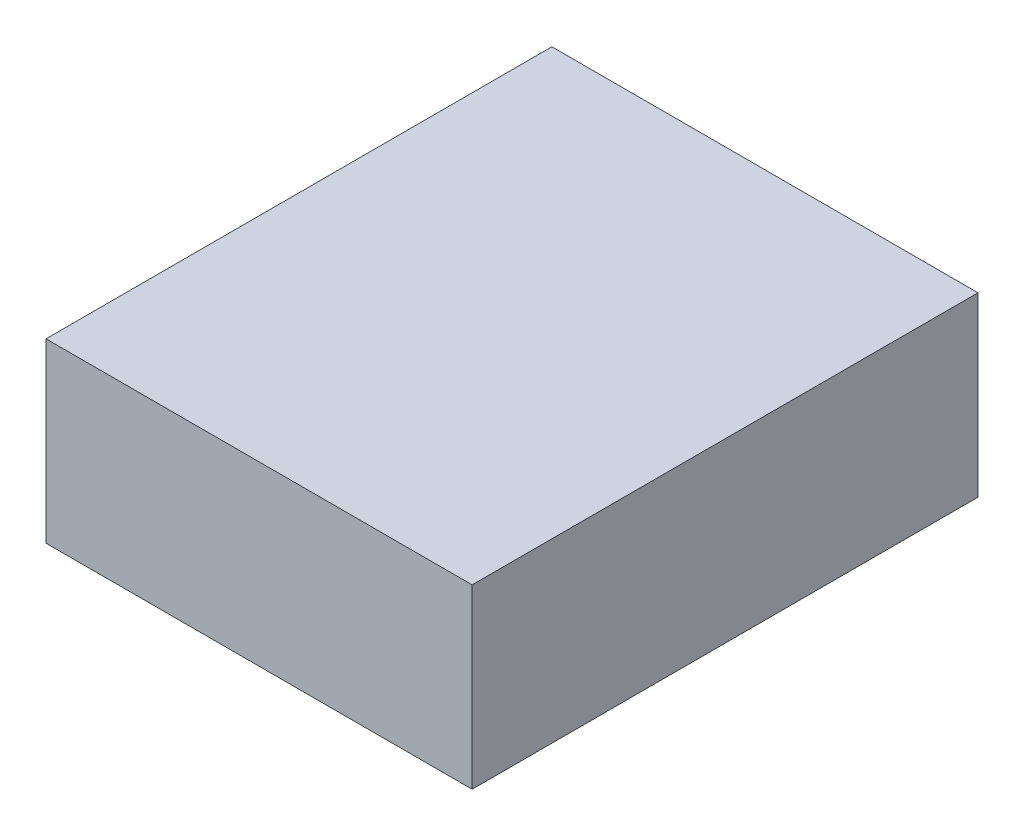
ISO-10303-21;
HEADER;
FILE_DESCRIPTION(('STEP AP214'),'2;1');
FILE_NAME('part.step','',(''),(''),'','','');
FILE_SCHEMA(('AUTOMOTIVE_DESIGN { 1 0 10303 214 1 1 1 1 }'));
ENDSEC;
DATA;
#1=APPLICATION_CONTEXT('core data for automotive mechanical design processes');
#2=APPLICATION_PROTOCOL_DEFINITION('international standard','automotive_design',2000,#1);
#3=PRODUCT_CONTEXT('',#1,'mechanical');
#4=PRODUCT('Part','Part','',(#3));
#5=PRODUCT_RELATED_PRODUCT_CATEGORY('part','',(#4));
#6=PRODUCT_DEFINITION_FORMATION('','',#4);
#7=PRODUCT_DEFINITION_CONTEXT('part definition',#1,'design');
#8=PRODUCT_DEFINITION('design','',#6,#7);
#9=PRODUCT_DEFINITION_SHAPE('','',#8);
#10=(LENGTH_UNIT() NAMED_UNIT(*) SI_UNIT(.MILLI.,.METRE.));
#11=(NAMED_UNIT(*) PLANE_ANGLE_UNIT() SI_UNIT($,.RADIAN.));
#12=(NAMED_UNIT(*) SI_UNIT($,.STERADIAN.) SOLID_ANGLE_UNIT());
#13=UNCERTAINTY_MEASURE_WITH_UNIT(LENGTH_MEASURE(1.E-05),#10,'distance_accuracy_value','');
#14=(GEOMETRIC_REPRESENTATION_CONTEXT(3) GLOBAL_UNCERTAINTY_ASSIGNED_CONTEXT((#13)) GLOBAL_UNIT_ASSIGNED_CONTEXT((#10,
#11,#12)) REPRESENTATION_CONTEXT('',''));
#15=CARTESIAN_POINT('',(0.,0.,0.));
#16=DIRECTION('',(0.,0.,1.));
#17=DIRECTION('',(1.,0.,0.));
#18=AXIS2_PLACEMENT_3D('',#15,#16,#17);
#19=CARTESIAN_POINT('',(0.,28.194,0.));
#20=DIRECTION('',(-1.,0.,0.));
#21=DIRECTION('',(0.,0.,1.));
#22=AXIS2_PLACEMENT_3D('',#19,#20,#21);
#23=PLANE('',#22);
#24=DIRECTION('',(0.,0.,-1.));
#25=VECTOR('',#24,1.);
#26=CARTESIAN_POINT('',(0.,0.,0.));
#27=LINE('',#26,#25);
#28=CARTESIAN_POINT('',(0.,0.,80.5688));
#29=VERTEX_POINT('',#28);
#30=CARTESIAN_POINT('',(0.,0.,0.));
#31=VERTEX_POINT('',#30);
#32=EDGE_CURVE('E96',#29,#31,#27,.T.);
#33=ORIENTED_EDGE('',*,*,#32,.T.);
#34=DIRECTION('',(0.,-1.,0.));
#35=VECTOR('',#34,1.);
#36=CARTESIAN_POINT('',(0.,28.194,0.));
#37=LINE('',#36,#35);
#38=CARTESIAN_POINT('',(0.,28.194,0.));
#39=VERTEX_POINT('',#38);
#40=EDGE_CURVE('E11',#39,#31,#37,.T.);
#41=ORIENTED_EDGE('',*,*,#40,.F.);
#42=DIRECTION('',(0.,0.,-1.));
#43=VECTOR('',#42,1.);
#44=CARTESIAN_POINT('',(0.,28.194,0.));
#45=LINE('',#44,#43);
#46=CARTESIAN_POINT('',(0.,28.194,80.5688));
#47=VERTEX_POINT('',#46);
#48=EDGE_CURVE('E84',#47,#39,#45,.T.);
#49=ORIENTED_EDGE('',*,*,#48,.F.);
#50=DIRECTION('',(0.,-1.,0.));
#51=VECTOR('',#50,1.);
#52=CARTESIAN_POINT('',(0.,28.194,80.5688));
#53=LINE('',#52,#51);
#54=EDGE_CURVE('E92',#47,#29,#53,.T.);
#55=ORIENTED_EDGE('',*,*,#54,.T.);
#56=EDGE_LOOP('',(#33,#41,#49,#55));
#57=FACE_BOUND('',#56,.T.);
#58=ADVANCED_FACE('F33',(#57),#23,.F.);
#59=CARTESIAN_POINT('',(0.,28.194,0.));
#60=DIRECTION('',(0.,0.,1.));
#61=DIRECTION('',(1.,0.,0.));
#62=AXIS2_PLACEMENT_3D('',#59,#60,#61);
#63=PLANE('',#62);
#64=DIRECTION('',(-1.,0.,0.));
#65=VECTOR('',#64,1.);
#66=CARTESIAN_POINT('',(0.,0.,0.));
#67=LINE('',#66,#65);
#68=CARTESIAN_POINT('',(-67.8688,0.,0.));
#69=VERTEX_POINT('',#68);
#70=EDGE_CURVE('E88',#31,#69,#67,.T.);
#71=ORIENTED_EDGE('',*,*,#70,.T.);
#72=DIRECTION('',(0.,-1.,0.));
#73=VECTOR('',#72,1.);
#74=CARTESIAN_POINT('',(-67.8688,28.194,0.));
#75=LINE('',#74,#73);
#76=CARTESIAN_POINT('',(-67.8688,28.194,0.));
#77=VERTEX_POINT('',#76);
#78=EDGE_CURVE('E41',#77,#69,#75,.T.);
#79=ORIENTED_EDGE('',*,*,#78,.F.);
#80=DIRECTION('',(-1.,0.,0.));
#81=VECTOR('',#80,1.);
#82=CARTESIAN_POINT('',(0.,28.194,0.));
#83=LINE('',#82,#81);
#84=EDGE_CURVE('E79',#39,#77,#83,.T.);
#85=ORIENTED_EDGE('',*,*,#84,.F.);
#86=ORIENTED_EDGE('',*,*,#40,.T.);
#87=EDGE_LOOP('',(#71,#79,#85,#86));
#88=FACE_BOUND('',#87,.T.);
#89=ADVANCED_FACE('F87',(#88),#63,.F.);
#90=CARTESIAN_POINT('',(-67.8688,28.194,0.));
#91=DIRECTION('',(1.,0.,0.));
#92=DIRECTION('',(0.,0.,-1.));
#93=AXIS2_PLACEMENT_3D('',#90,#91,#92);
#94=PLANE('',#93);
#95=DIRECTION('',(0.,0.,1.));
#96=VECTOR('',#95,1.);
#97=CARTESIAN_POINT('',(-67.8688,0.,0.));
#98=LINE('',#97,#96);
#99=CARTESIAN_POINT('',(-67.8688,0.,80.5688));
#100=VERTEX_POINT('',#99);
#101=EDGE_CURVE('E66',#69,#100,#98,.T.);
#102=ORIENTED_EDGE('',*,*,#101,.T.);
#103=DIRECTION('',(0.,-1.,0.));
#104=VECTOR('',#103,1.);
#105=CARTESIAN_POINT('',(-67.8688,28.194,80.5688));
#106=LINE('',#105,#104);
#107=CARTESIAN_POINT('',(-67.8688,28.194,80.5688));
#108=VERTEX_POINT('',#107);
#109=EDGE_CURVE('E89',#108,#100,#106,.T.);
#110=ORIENTED_EDGE('',*,*,#109,.F.);
#111=DIRECTION('',(0.,0.,1.));
#112=VECTOR('',#111,1.);
#113=CARTESIAN_POINT('',(-67.8688,28.194,0.));
#114=LINE('',#113,#112);
#115=EDGE_CURVE('E82',#77,#108,#114,.T.);
#116=ORIENTED_EDGE('',*,*,#115,.F.);
#117=ORIENTED_EDGE('',*,*,#78,.T.);
#118=EDGE_LOOP('',(#102,#110,#116,#117));
#119=FACE_BOUND('',#118,.T.);
#120=ADVANCED_FACE('F90',(#119),#94,.F.);
#121=CARTESIAN_POINT('',(0.,28.194,80.5688));
#122=DIRECTION('',(0.,0.,-1.));
#123=DIRECTION('',(-1.,0.,0.));
#124=AXIS2_PLACEMENT_3D('',#121,#122,#123);
#125=PLANE('',#124);
#126=DIRECTION('',(1.,0.,0.));
#127=VECTOR('',#126,1.);
#128=CARTESIAN_POINT('',(0.,0.,80.5688));
#129=LINE('',#128,#127);
#130=EDGE_CURVE('E72',#100,#29,#129,.T.);
#131=ORIENTED_EDGE('',*,*,#130,.T.);
#132=ORIENTED_EDGE('',*,*,#54,.F.);
#133=DIRECTION('',(1.,0.,0.));
#134=VECTOR('',#133,1.);
#135=CARTESIAN_POINT('',(0.,28.194,80.5688));
#136=LINE('',#135,#134);
#137=EDGE_CURVE('E49',#108,#47,#136,.T.);
#138=ORIENTED_EDGE('',*,*,#137,.F.);
#139=ORIENTED_EDGE('',*,*,#109,.T.);
#140=EDGE_LOOP('',(#131,#132,#138,#139));
#141=FACE_BOUND('',#140,.T.);
#142=ADVANCED_FACE('F103',(#141),#125,.F.);
#143=CARTESIAN_POINT('',(0.,28.194,0.));
#144=DIRECTION('',(0.,-1.,0.));
#145=DIRECTION('',(0.,0.,-1.));
#146=AXIS2_PLACEMENT_3D('',#143,#144,#145);
#147=PLANE('',#146);
#148=ORIENTED_EDGE('',*,*,#48,.T.);
#149=ORIENTED_EDGE('',*,*,#84,.T.);
#150=ORIENTED_EDGE('',*,*,#115,.T.);
#151=ORIENTED_EDGE('',*,*,#137,.T.);
#152=EDGE_LOOP('',(#148,#149,#150,#151));
#153=FACE_BOUND('',#152,.T.);
#154=ADVANCED_FACE('F80',(#153),#147,.F.);
#155=CARTESIAN_POINT('',(0.,0.,0.));
#156=DIRECTION('',(0.,-1.,0.));
#157=DIRECTION('',(0.,0.,-1.));
#158=AXIS2_PLACEMENT_3D('',#155,#156,#157);
#159=PLANE('',#158);
#160=ORIENTED_EDGE('',*,*,#32,.F.);
#161=ORIENTED_EDGE('',*,*,#130,.F.);
#162=ORIENTED_EDGE('',*,*,#101,.F.);
#163=ORIENTED_EDGE('',*,*,#70,.F.);
#164=EDGE_LOOP('',(#160,#161,#162,#163));
#165=FACE_BOUND('',#164,.T.);
#166=ADVANCED_FACE('F106',(#165),#159,.T.);
#167=CLOSED_SHELL('',(#58,#89,#120,#142,#154,#166));
#168=MANIFOLD_SOLID_BREP('B2',#167);
#169=ADVANCED_BREP_SHAPE_REPRESENTATION('',(#18,#168),#14);
#170=SHAPE_DEFINITION_REPRESENTATION(#9,#169);
ENDSEC;
END-ISO-10303-21;
